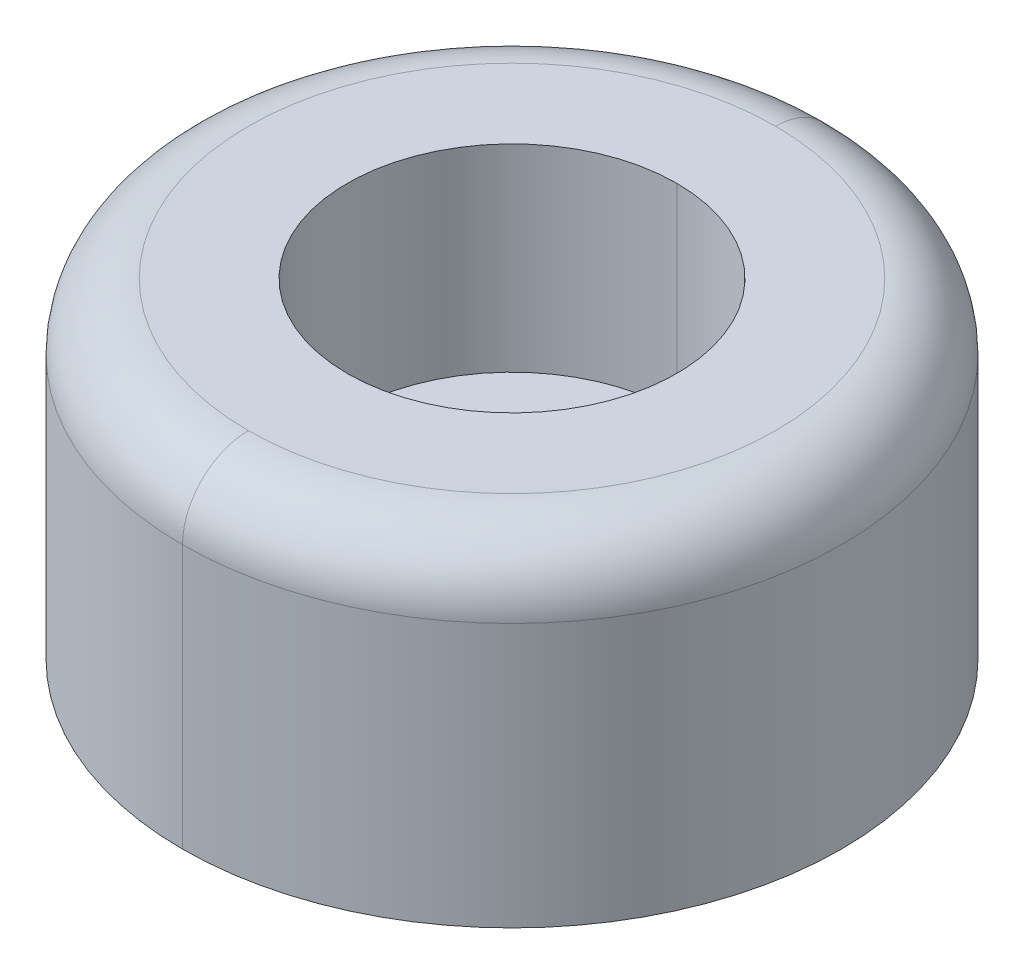
ISO-10303-21;
HEADER;
FILE_DESCRIPTION(('STEP AP214'),'2;1');
FILE_NAME('part.step','',(''),(''),'','','');
FILE_SCHEMA(('AUTOMOTIVE_DESIGN { 1 0 10303 214 1 1 1 1 }'));
ENDSEC;
DATA;
#1=APPLICATION_CONTEXT('core data for automotive mechanical design processes');
#2=APPLICATION_PROTOCOL_DEFINITION('international standard','automotive_design',2000,#1);
#3=PRODUCT_CONTEXT('',#1,'mechanical');
#4=PRODUCT('Part','Part','',(#3));
#5=PRODUCT_RELATED_PRODUCT_CATEGORY('part','',(#4));
#6=PRODUCT_DEFINITION_FORMATION('','',#4);
#7=PRODUCT_DEFINITION_CONTEXT('part definition',#1,'design');
#8=PRODUCT_DEFINITION('design','',#6,#7);
#9=PRODUCT_DEFINITION_SHAPE('','',#8);
#10=(LENGTH_UNIT() NAMED_UNIT(*) SI_UNIT(.MILLI.,.METRE.));
#11=(NAMED_UNIT(*) PLANE_ANGLE_UNIT() SI_UNIT($,.RADIAN.));
#12=(NAMED_UNIT(*) SI_UNIT($,.STERADIAN.) SOLID_ANGLE_UNIT());
#13=UNCERTAINTY_MEASURE_WITH_UNIT(LENGTH_MEASURE(1.E-05),#10,'distance_accuracy_value','');
#14=(GEOMETRIC_REPRESENTATION_CONTEXT(3) GLOBAL_UNCERTAINTY_ASSIGNED_CONTEXT((#13)) GLOBAL_UNIT_ASSIGNED_CONTEXT((#10,
#11,#12)) REPRESENTATION_CONTEXT('',''));
#15=CARTESIAN_POINT('',(0.,0.,0.));
#16=DIRECTION('',(0.,0.,1.));
#17=DIRECTION('',(1.,0.,0.));
#18=AXIS2_PLACEMENT_3D('',#15,#16,#17);
#19=CARTESIAN_POINT('',(-5.00932628710871E-10,2.41250700350004,0.));
#20=DIRECTION('',(0.,1.,0.));
#21=DIRECTION('',(0.,0.,1.));
#22=AXIS2_PLACEMENT_3D('',#19,#20,#21);
#23=CYLINDRICAL_SURFACE('',#22,5.);
#24=DIRECTION('',(0.,1.,0.));
#25=VECTOR('',#24,1.);
#26=CARTESIAN_POINT('',(-5.00932016407694E-10,2.41250700350004,-5.));
#27=LINE('',#26,#25);
#28=CARTESIAN_POINT('',(-5.00932016407694E-10,-4.99999999650043,-5.));
#29=VERTEX_POINT('',#28);
#30=CARTESIAN_POINT('',(-5.00932016407694E-10,-0.999999996500442,-5.));
#31=VERTEX_POINT('',#30);
#32=EDGE_CURVE('E122',#29,#31,#27,.T.);
#33=ORIENTED_EDGE('',*,*,#32,.F.);
#34=CARTESIAN_POINT('',(-5.00932628710871E-10,-4.99999999650043,0.));
#35=DIRECTION('',(0.,1.,0.));
#36=DIRECTION('',(0.,0.,1.));
#37=AXIS2_PLACEMENT_3D('',#34,#35,#36);
#38=CIRCLE('',#37,5.);
#39=CARTESIAN_POINT('',(-5.00932628710871E-10,-4.99999999650043,5.));
#40=VERTEX_POINT('',#39);
#41=EDGE_CURVE('E11',#29,#40,#38,.T.);
#42=ORIENTED_EDGE('',*,*,#41,.T.);
#43=DIRECTION('',(0.,1.,0.));
#44=VECTOR('',#43,1.);
#45=CARTESIAN_POINT('',(-5.00932628710871E-10,2.41250700350004,5.));
#46=LINE('',#45,#44);
#47=CARTESIAN_POINT('',(-5.00932628710871E-10,-0.999999996500442,5.));
#48=VERTEX_POINT('',#47);
#49=EDGE_CURVE('E114',#40,#48,#46,.T.);
#50=ORIENTED_EDGE('',*,*,#49,.T.);
#51=CARTESIAN_POINT('',(-5.00932628710871E-10,-0.999999996500442,0.));
#52=DIRECTION('',(0.,1.,0.));
#53=DIRECTION('',(0.,0.,1.));
#54=AXIS2_PLACEMENT_3D('',#51,#52,#53);
#55=CIRCLE('',#54,5.);
#56=EDGE_CURVE('E92',#31,#48,#55,.T.);
#57=ORIENTED_EDGE('',*,*,#56,.F.);
#58=EDGE_LOOP('',(#33,#42,#50,#57));
#59=FACE_BOUND('',#58,.T.);
#60=ADVANCED_FACE('F16',(#59),#23,.T.);
#61=CARTESIAN_POINT('',(1.49999999949907,-4.99999999650043,0.));
#62=DIRECTION('',(0.,1.,0.));
#63=DIRECTION('',(1.,0.,0.));
#64=AXIS2_PLACEMENT_3D('',#61,#62,#63);
#65=PLANE('',#64);
#66=CARTESIAN_POINT('',(-5.00932628710871E-10,-4.99999999650043,0.));
#67=DIRECTION('',(0.,1.,0.));
#68=DIRECTION('',(0.,0.,1.));
#69=AXIS2_PLACEMENT_3D('',#66,#67,#68);
#70=CIRCLE('',#69,1.5);
#71=CARTESIAN_POINT('',(-5.00932628710871E-10,-4.99999999650043,1.5));
#72=VERTEX_POINT('',#71);
#73=CARTESIAN_POINT('',(-5.00932445019918E-10,-4.99999999650043,-1.5));
#74=VERTEX_POINT('',#73);
#75=EDGE_CURVE('E27',#72,#74,#70,.T.);
#76=ORIENTED_EDGE('',*,*,#75,.T.);
#77=CARTESIAN_POINT('',(-5.00932628710871E-10,-4.99999999650043,0.));
#78=DIRECTION('',(0.,1.,0.));
#79=DIRECTION('',(0.,0.,1.));
#80=AXIS2_PLACEMENT_3D('',#77,#78,#79);
#81=CIRCLE('',#80,1.5);
#82=EDGE_CURVE('E119',#74,#72,#81,.T.);
#83=ORIENTED_EDGE('',*,*,#82,.T.);
#84=EDGE_LOOP('',(#76,#83));
#85=FACE_BOUND('',#84,.T.);
#86=CARTESIAN_POINT('',(-5.00932628710871E-10,-4.99999999650043,0.));
#87=DIRECTION('',(0.,1.,0.));
#88=DIRECTION('',(0.,0.,1.));
#89=AXIS2_PLACEMENT_3D('',#86,#87,#88);
#90=CIRCLE('',#89,5.);
#91=EDGE_CURVE('E129',#40,#29,#90,.T.);
#92=ORIENTED_EDGE('',*,*,#91,.F.);
#93=ORIENTED_EDGE('',*,*,#41,.F.);
#94=EDGE_LOOP('',(#92,#93));
#95=FACE_BOUND('',#94,.T.);
#96=ADVANCED_FACE('F179',(#85,#95),#65,.F.);
#97=CARTESIAN_POINT('',(-5.00932628710871E-10,2.41250700350004,0.));
#98=DIRECTION('',(0.,1.,0.));
#99=DIRECTION('',(0.,0.,1.));
#100=AXIS2_PLACEMENT_3D('',#97,#98,#99);
#101=CYLINDRICAL_SURFACE('',#100,1.5);
#102=DIRECTION('',(0.,1.,0.));
#103=VECTOR('',#102,1.);
#104=CARTESIAN_POINT('',(-5.00932445019918E-10,2.41250700350004,-1.5));
#105=LINE('',#104,#103);
#106=CARTESIAN_POINT('',(-5.00932445019918E-10,-2.99999999650044,-1.5));
#107=VERTEX_POINT('',#106);
#108=EDGE_CURVE('E148',#74,#107,#105,.T.);
#109=ORIENTED_EDGE('',*,*,#108,.F.);
#110=ORIENTED_EDGE('',*,*,#75,.F.);
#111=DIRECTION('',(0.,1.,0.));
#112=VECTOR('',#111,1.);
#113=CARTESIAN_POINT('',(-5.00932628710871E-10,2.41250700350004,1.5));
#114=LINE('',#113,#112);
#115=CARTESIAN_POINT('',(-5.00932628710871E-10,-2.99999999650044,1.5));
#116=VERTEX_POINT('',#115);
#117=EDGE_CURVE('E158',#72,#116,#114,.T.);
#118=ORIENTED_EDGE('',*,*,#117,.T.);
#119=CARTESIAN_POINT('',(-5.00932628710871E-10,-2.99999999650044,0.));
#120=DIRECTION('',(0.,1.,0.));
#121=DIRECTION('',(0.,0.,1.));
#122=AXIS2_PLACEMENT_3D('',#119,#120,#121);
#123=CIRCLE('',#122,1.5);
#124=EDGE_CURVE('E142',#116,#107,#123,.T.);
#125=ORIENTED_EDGE('',*,*,#124,.T.);
#126=EDGE_LOOP('',(#109,#110,#118,#125));
#127=FACE_BOUND('',#126,.T.);
#128=ADVANCED_FACE('F184',(#127),#101,.F.);
#129=CARTESIAN_POINT('',(1.49999999949907,-2.99999999650044,0.));
#130=DIRECTION('',(0.,-1.,0.));
#131=DIRECTION('',(0.,0.,-1.));
#132=AXIS2_PLACEMENT_3D('',#129,#130,#131);
#133=PLANE('',#132);
#134=ORIENTED_EDGE('',*,*,#124,.F.);
#135=CARTESIAN_POINT('',(-5.00932628710871E-10,-2.99999999650044,0.));
#136=DIRECTION('',(0.,1.,0.));
#137=DIRECTION('',(0.,0.,1.));
#138=AXIS2_PLACEMENT_3D('',#135,#136,#137);
#139=CIRCLE('',#138,1.5);
#140=EDGE_CURVE('E162',#107,#116,#139,.T.);
#141=ORIENTED_EDGE('',*,*,#140,.F.);
#142=EDGE_LOOP('',(#134,#141));
#143=FACE_BOUND('',#142,.T.);
#144=CARTESIAN_POINT('',(-5.00932628710871E-10,-2.99999999650044,0.));
#145=DIRECTION('',(0.,1.,0.));
#146=DIRECTION('',(0.,0.,1.));
#147=AXIS2_PLACEMENT_3D('',#144,#145,#146);
#148=CIRCLE('',#147,2.5);
#149=CARTESIAN_POINT('',(-5.00932628710871E-10,-2.99999999650044,2.5));
#150=VERTEX_POINT('',#149);
#151=CARTESIAN_POINT('',(-5.00932322559282E-10,-2.99999999650044,-2.5));
#152=VERTEX_POINT('',#151);
#153=EDGE_CURVE('E145',#150,#152,#148,.T.);
#154=ORIENTED_EDGE('',*,*,#153,.T.);
#155=CARTESIAN_POINT('',(-5.00932628710871E-10,-2.99999999650044,0.));
#156=DIRECTION('',(0.,1.,0.));
#157=DIRECTION('',(0.,0.,1.));
#158=AXIS2_PLACEMENT_3D('',#155,#156,#157);
#159=CIRCLE('',#158,2.5);
#160=EDGE_CURVE('E20',#152,#150,#159,.T.);
#161=ORIENTED_EDGE('',*,*,#160,.T.);
#162=EDGE_LOOP('',(#154,#161));
#163=FACE_BOUND('',#162,.T.);
#164=ADVANCED_FACE('F189',(#143,#163),#133,.F.);
#165=CARTESIAN_POINT('',(-5.00932628710871E-10,2.41250700350004,0.));
#166=DIRECTION('',(0.,1.,0.));
#167=DIRECTION('',(0.,0.,1.));
#168=AXIS2_PLACEMENT_3D('',#165,#166,#167);
#169=CYLINDRICAL_SURFACE('',#168,2.5);
#170=DIRECTION('',(0.,1.,0.));
#171=VECTOR('',#170,1.);
#172=CARTESIAN_POINT('',(-5.00932322559282E-10,2.41250700350004,-2.5));
#173=LINE('',#172,#171);
#174=CARTESIAN_POINT('',(-5.00932322559282E-10,3.49956522094353E-09,-2.5));
#175=VERTEX_POINT('',#174);
#176=EDGE_CURVE('E135',#152,#175,#173,.T.);
#177=ORIENTED_EDGE('',*,*,#176,.F.);
#178=ORIENTED_EDGE('',*,*,#153,.F.);
#179=DIRECTION('',(0.,1.,0.));
#180=VECTOR('',#179,1.);
#181=CARTESIAN_POINT('',(-5.00932628710871E-10,2.41250700350004,2.5));
#182=LINE('',#181,#180);
#183=CARTESIAN_POINT('',(-5.00932628710871E-10,3.49956522094353E-09,2.5));
#184=VERTEX_POINT('',#183);
#185=EDGE_CURVE('E134',#150,#184,#182,.T.);
#186=ORIENTED_EDGE('',*,*,#185,.T.);
#187=CARTESIAN_POINT('',(-5.00932628710871E-10,3.49956522094353E-09,0.));
#188=DIRECTION('',(0.,1.,0.));
#189=DIRECTION('',(0.,0.,1.));
#190=AXIS2_PLACEMENT_3D('',#187,#188,#189);
#191=CIRCLE('',#190,2.5);
#192=EDGE_CURVE('E151',#184,#175,#191,.T.);
#193=ORIENTED_EDGE('',*,*,#192,.T.);
#194=EDGE_LOOP('',(#177,#178,#186,#193));
#195=FACE_BOUND('',#194,.T.);
#196=ADVANCED_FACE('F192',(#195),#169,.F.);
#197=CARTESIAN_POINT('',(3.99999999949906,3.49956543778396E-09,0.));
#198=DIRECTION('',(0.,-1.,0.));
#199=DIRECTION('',(0.,0.,-1.));
#200=AXIS2_PLACEMENT_3D('',#197,#198,#199);
#201=PLANE('',#200);
#202=ORIENTED_EDGE('',*,*,#192,.F.);
#203=CARTESIAN_POINT('',(-5.00932628710871E-10,3.49956522094353E-09,0.));
#204=DIRECTION('',(0.,1.,0.));
#205=DIRECTION('',(0.,0.,1.));
#206=AXIS2_PLACEMENT_3D('',#203,#204,#205);
#207=CIRCLE('',#206,2.5);
#208=EDGE_CURVE('E139',#175,#184,#207,.T.);
#209=ORIENTED_EDGE('',*,*,#208,.F.);
#210=EDGE_LOOP('',(#202,#209));
#211=FACE_BOUND('',#210,.T.);
#212=CARTESIAN_POINT('',(-5.00932628710871E-10,3.49956522094353E-09,0.));
#213=DIRECTION('',(0.,1.,0.));
#214=DIRECTION('',(0.,0.,1.));
#215=AXIS2_PLACEMENT_3D('',#212,#213,#214);
#216=CIRCLE('',#215,4.);
#217=CARTESIAN_POINT('',(-5.00932628710871E-10,3.49956522094353E-09,4.));
#218=VERTEX_POINT('',#217);
#219=CARTESIAN_POINT('',(-5.00932077638011E-10,3.49956522094353E-09,-4.));
#220=VERTEX_POINT('',#219);
#221=EDGE_CURVE('E110',#218,#220,#216,.T.);
#222=ORIENTED_EDGE('',*,*,#221,.T.);
#223=CARTESIAN_POINT('',(-5.00932628710871E-10,3.49956522094353E-09,0.));
#224=DIRECTION('',(0.,1.,0.));
#225=DIRECTION('',(0.,0.,1.));
#226=AXIS2_PLACEMENT_3D('',#223,#224,#225);
#227=CIRCLE('',#226,4.);
#228=EDGE_CURVE('E41',#220,#218,#227,.T.);
#229=ORIENTED_EDGE('',*,*,#228,.T.);
#230=EDGE_LOOP('',(#222,#229));
#231=FACE_BOUND('',#230,.T.);
#232=ADVANCED_FACE('F316',(#211,#231),#201,.F.);
#233=CARTESIAN_POINT('',(-5.00932628710871E-10,-0.999999996500434,0.));
#234=DIRECTION('',(0.,1.,0.));
#235=DIRECTION('',(0.,0.,1.));
#236=AXIS2_PLACEMENT_3D('',#233,#234,#235);
#237=TOROIDAL_SURFACE('',#236,4.,1.);
#238=CARTESIAN_POINT('',(-5.00932138868329E-10,-0.999999996500434,-4.));
#239=DIRECTION('',(1.,0.,0.));
#240=DIRECTION('',(0.,0.,-1.));
#241=AXIS2_PLACEMENT_3D('',#238,#239,#240);
#242=CIRCLE('',#241,1.);
#243=EDGE_CURVE('E98',#31,#220,#242,.T.);
#244=ORIENTED_EDGE('',*,*,#243,.F.);
#245=ORIENTED_EDGE('',*,*,#56,.T.);
#246=CARTESIAN_POINT('',(-5.00932628710871E-10,-0.999999996500434,4.));
#247=DIRECTION('',(-1.,0.,0.));
#248=DIRECTION('',(0.,0.,1.));
#249=AXIS2_PLACEMENT_3D('',#246,#247,#248);
#250=CIRCLE('',#249,1.);
#251=EDGE_CURVE('E95',#48,#218,#250,.T.);
#252=ORIENTED_EDGE('',*,*,#251,.T.);
#253=ORIENTED_EDGE('',*,*,#228,.F.);
#254=EDGE_LOOP('',(#244,#245,#252,#253));
#255=FACE_BOUND('',#254,.T.);
#256=ADVANCED_FACE('F94',(#255),#237,.T.);
#257=CARTESIAN_POINT('',(-5.00932628710871E-10,-0.999999996500434,0.));
#258=DIRECTION('',(0.,1.,0.));
#259=DIRECTION('',(0.,0.,1.));
#260=AXIS2_PLACEMENT_3D('',#257,#258,#259);
#261=TOROIDAL_SURFACE('',#260,4.,1.);
#262=CARTESIAN_POINT('',(-5.00932628710871E-10,-0.999999996500442,0.));
#263=DIRECTION('',(0.,1.,0.));
#264=DIRECTION('',(0.,0.,1.));
#265=AXIS2_PLACEMENT_3D('',#262,#263,#264);
#266=CIRCLE('',#265,5.);
#267=EDGE_CURVE('E108',#48,#31,#266,.T.);
#268=ORIENTED_EDGE('',*,*,#267,.T.);
#269=ORIENTED_EDGE('',*,*,#243,.T.);
#270=ORIENTED_EDGE('',*,*,#221,.F.);
#271=ORIENTED_EDGE('',*,*,#251,.F.);
#272=EDGE_LOOP('',(#268,#269,#270,#271));
#273=FACE_BOUND('',#272,.T.);
#274=ADVANCED_FACE('F106',(#273),#261,.T.);
#275=CARTESIAN_POINT('',(-5.00932628710871E-10,2.41250700350004,0.));
#276=DIRECTION('',(0.,1.,0.));
#277=DIRECTION('',(0.,0.,1.));
#278=AXIS2_PLACEMENT_3D('',#275,#276,#277);
#279=CYLINDRICAL_SURFACE('',#278,2.5);
#280=ORIENTED_EDGE('',*,*,#160,.F.);
#281=ORIENTED_EDGE('',*,*,#176,.T.);
#282=ORIENTED_EDGE('',*,*,#208,.T.);
#283=ORIENTED_EDGE('',*,*,#185,.F.);
#284=EDGE_LOOP('',(#280,#281,#282,#283));
#285=FACE_BOUND('',#284,.T.);
#286=ADVANCED_FACE('F18',(#285),#279,.F.);
#287=CARTESIAN_POINT('',(-5.00932628710871E-10,2.41250700350004,0.));
#288=DIRECTION('',(0.,1.,0.));
#289=DIRECTION('',(0.,0.,1.));
#290=AXIS2_PLACEMENT_3D('',#287,#288,#289);
#291=CYLINDRICAL_SURFACE('',#290,1.5);
#292=ORIENTED_EDGE('',*,*,#82,.F.);
#293=ORIENTED_EDGE('',*,*,#108,.T.);
#294=ORIENTED_EDGE('',*,*,#140,.T.);
#295=ORIENTED_EDGE('',*,*,#117,.F.);
#296=EDGE_LOOP('',(#292,#293,#294,#295));
#297=FACE_BOUND('',#296,.T.);
#298=ADVANCED_FACE('F187',(#297),#291,.F.);
#299=CARTESIAN_POINT('',(-5.00932628710871E-10,2.41250700350004,0.));
#300=DIRECTION('',(0.,1.,0.));
#301=DIRECTION('',(0.,0.,1.));
#302=AXIS2_PLACEMENT_3D('',#299,#300,#301);
#303=CYLINDRICAL_SURFACE('',#302,5.);
#304=ORIENTED_EDGE('',*,*,#91,.T.);
#305=ORIENTED_EDGE('',*,*,#32,.T.);
#306=ORIENTED_EDGE('',*,*,#267,.F.);
#307=ORIENTED_EDGE('',*,*,#49,.F.);
#308=EDGE_LOOP('',(#304,#305,#306,#307));
#309=FACE_BOUND('',#308,.T.);
#310=ADVANCED_FACE('F121',(#309),#303,.T.);
#311=CLOSED_SHELL('',(#60,#96,#128,#164,#196,#232,#256,#274,#286,#298,#310));
#312=MANIFOLD_SOLID_BREP('B1',#311);
#313=ADVANCED_BREP_SHAPE_REPRESENTATION('',(#18,#312),#14);
#314=SHAPE_DEFINITION_REPRESENTATION(#9,#313);
ENDSEC;
END-ISO-10303-21;
